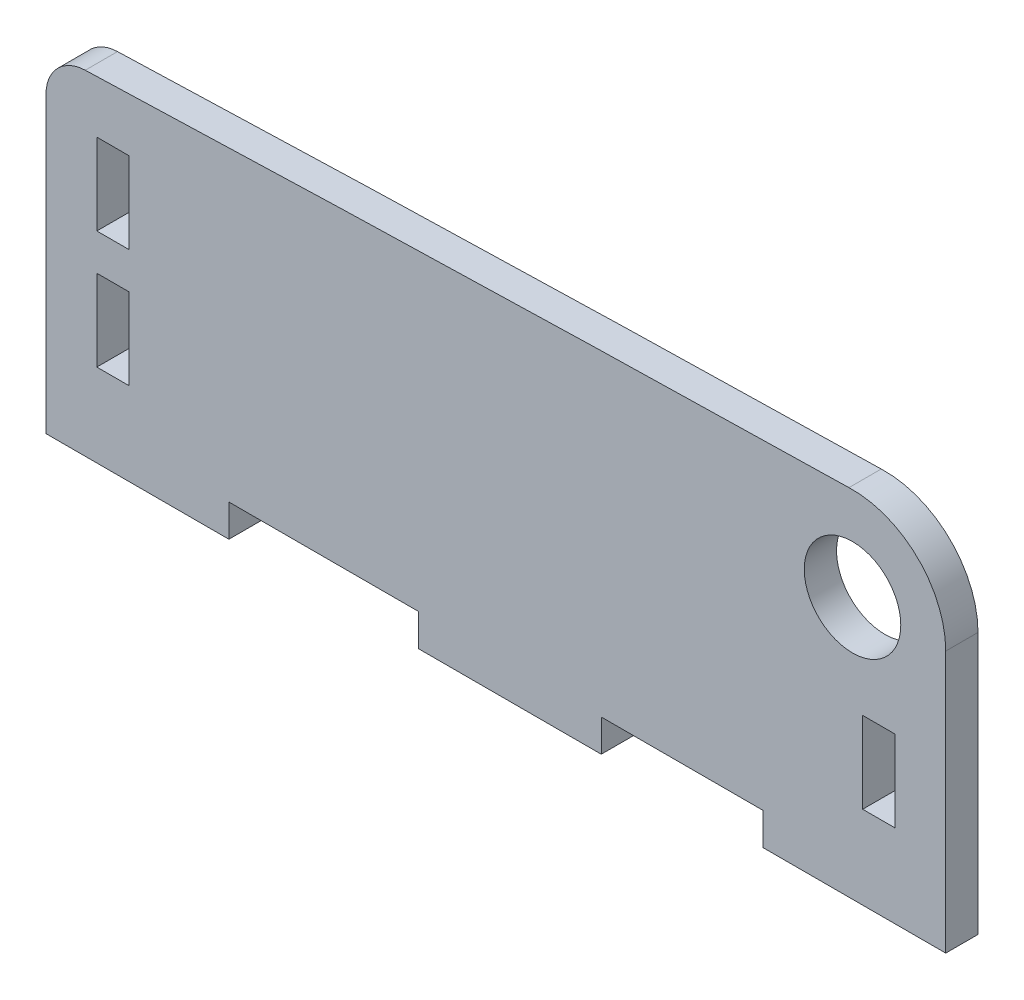
ISO-10303-21;
HEADER;
FILE_DESCRIPTION(('STEP AP214'),'2;1');
FILE_NAME('part.step','',(''),(''),'','','');
FILE_SCHEMA(('AUTOMOTIVE_DESIGN { 1 0 10303 214 1 1 1 1 }'));
ENDSEC;
DATA;
#1=APPLICATION_CONTEXT('core data for automotive mechanical design processes');
#2=APPLICATION_PROTOCOL_DEFINITION('international standard','automotive_design',2000,#1);
#3=PRODUCT_CONTEXT('',#1,'mechanical');
#4=PRODUCT('Part','Part','',(#3));
#5=PRODUCT_RELATED_PRODUCT_CATEGORY('part','',(#4));
#6=PRODUCT_DEFINITION_FORMATION('','',#4);
#7=PRODUCT_DEFINITION_CONTEXT('part definition',#1,'design');
#8=PRODUCT_DEFINITION('design','',#6,#7);
#9=PRODUCT_DEFINITION_SHAPE('','',#8);
#10=(LENGTH_UNIT() NAMED_UNIT(*) SI_UNIT(.MILLI.,.METRE.));
#11=(NAMED_UNIT(*) PLANE_ANGLE_UNIT() SI_UNIT($,.RADIAN.));
#12=(NAMED_UNIT(*) SI_UNIT($,.STERADIAN.) SOLID_ANGLE_UNIT());
#13=UNCERTAINTY_MEASURE_WITH_UNIT(LENGTH_MEASURE(1.E-05),#10,'distance_accuracy_value','');
#14=(GEOMETRIC_REPRESENTATION_CONTEXT(3) GLOBAL_UNCERTAINTY_ASSIGNED_CONTEXT((#13)) GLOBAL_UNIT_ASSIGNED_CONTEXT((#10,
#11,#12)) REPRESENTATION_CONTEXT('',''));
#15=CARTESIAN_POINT('',(0.,0.,0.));
#16=DIRECTION('',(0.,0.,1.));
#17=DIRECTION('',(1.,0.,0.));
#18=AXIS2_PLACEMENT_3D('',#15,#16,#17);
#19=CARTESIAN_POINT('',(26.416,-14.8,3.175));
#20=DIRECTION('',(0.,-1.,0.));
#21=DIRECTION('',(1.,0.,0.));
#22=AXIS2_PLACEMENT_3D('',#19,#20,#21);
#23=PLANE('',#22);
#24=DIRECTION('',(0.,0.,-1.));
#25=VECTOR('',#24,1.);
#26=CARTESIAN_POINT('',(-20.8,-14.8,21.4528725512572));
#27=LINE('',#26,#25);
#28=CARTESIAN_POINT('',(-20.8,-14.8,3.175));
#29=VERTEX_POINT('',#28);
#30=CARTESIAN_POINT('',(-20.8,-14.8,0.));
#31=VERTEX_POINT('',#30);
#32=EDGE_CURVE('E59',#29,#31,#27,.T.);
#33=ORIENTED_EDGE('',*,*,#32,.T.);
#34=DIRECTION('',(-1.,0.,0.));
#35=VECTOR('',#34,1.);
#36=CARTESIAN_POINT('',(26.416,-14.8,0.));
#37=LINE('',#36,#35);
#38=CARTESIAN_POINT('',(-2.15000000000001,-14.8,0.));
#39=VERTEX_POINT('',#38);
#40=EDGE_CURVE('E273',#39,#31,#37,.T.);
#41=ORIENTED_EDGE('',*,*,#40,.F.);
#42=DIRECTION('',(0.,0.,-1.));
#43=VECTOR('',#42,1.);
#44=CARTESIAN_POINT('',(-2.15000000000001,-14.8,21.4528725512572));
#45=LINE('',#44,#43);
#46=CARTESIAN_POINT('',(-2.15000000000001,-14.8,3.175));
#47=VERTEX_POINT('',#46);
#48=EDGE_CURVE('E599',#47,#39,#45,.T.);
#49=ORIENTED_EDGE('',*,*,#48,.F.);
#50=DIRECTION('',(-1.,0.,0.));
#51=VECTOR('',#50,1.);
#52=CARTESIAN_POINT('',(26.416,-14.8,3.175));
#53=LINE('',#52,#51);
#54=EDGE_CURVE('E64',#47,#29,#53,.T.);
#55=ORIENTED_EDGE('',*,*,#54,.T.);
#56=EDGE_LOOP('',(#33,#41,#49,#55));
#57=FACE_BOUND('',#56,.T.);
#58=ADVANCED_FACE('F44',(#57),#23,.T.);
#59=CARTESIAN_POINT('',(40.576,7.77,15.1599874843489));
#60=DIRECTION('',(0.,0.,-1.));
#61=DIRECTION('',(-1.,0.,0.));
#62=AXIS2_PLACEMENT_3D('',#59,#60,#61);
#63=CYLINDRICAL_SURFACE('',#62,9.17500000000001);
#64=CARTESIAN_POINT('',(40.576,7.77,0.));
#65=DIRECTION('',(0.,0.,-1.));
#66=DIRECTION('',(-1.,0.,0.));
#67=AXIS2_PLACEMENT_3D('',#64,#65,#66);
#68=CIRCLE('',#67,9.17500000000001);
#69=CARTESIAN_POINT('',(40.2258480765746,16.9383160193419,0.));
#70=VERTEX_POINT('',#69);
#71=CARTESIAN_POINT('',(49.751,7.77,0.));
#72=VERTEX_POINT('',#71);
#73=EDGE_CURVE('E324',#70,#72,#68,.T.);
#74=ORIENTED_EDGE('',*,*,#73,.F.);
#75=DIRECTION('',(0.,0.,-1.));
#76=VECTOR('',#75,1.);
#77=CARTESIAN_POINT('',(40.2258480765746,16.9383160193419,82.2297725290536));
#78=LINE('',#77,#76);
#79=CARTESIAN_POINT('',(40.2258480765746,16.9383160193419,3.175));
#80=VERTEX_POINT('',#79);
#81=EDGE_CURVE('E463',#80,#70,#78,.T.);
#82=ORIENTED_EDGE('',*,*,#81,.F.);
#83=CARTESIAN_POINT('',(40.576,7.77,3.175));
#84=DIRECTION('',(0.,0.,1.));
#85=DIRECTION('',(1.,0.,0.));
#86=AXIS2_PLACEMENT_3D('',#83,#84,#85);
#87=CIRCLE('',#86,9.17500000000001);
#88=CARTESIAN_POINT('',(49.751,7.77,3.175));
#89=VERTEX_POINT('',#88);
#90=EDGE_CURVE('E328',#80,#89,#87,.F.);
#91=ORIENTED_EDGE('',*,*,#90,.T.);
#92=DIRECTION('',(0.,0.,-1.));
#93=VECTOR('',#92,1.);
#94=CARTESIAN_POINT('',(49.751,7.77,10.));
#95=LINE('',#94,#93);
#96=EDGE_CURVE('E316',#89,#72,#95,.T.);
#97=ORIENTED_EDGE('',*,*,#96,.T.);
#98=EDGE_LOOP('',(#74,#82,#91,#97));
#99=FACE_BOUND('',#98,.T.);
#100=ADVANCED_FACE('F486',(#99),#63,.T.);
#101=CARTESIAN_POINT('',(-30.625,0.,33.0727537785032));
#102=DIRECTION('',(1.,0.,0.));
#103=DIRECTION('',(0.,1.,0.));
#104=AXIS2_PLACEMENT_3D('',#101,#102,#103);
#105=PLANE('',#104);
#106=DIRECTION('',(0.,0.,-1.));
#107=VECTOR('',#106,1.);
#108=CARTESIAN_POINT('',(-30.625,-9.79999999999999,33.8831524191867));
#109=LINE('',#108,#107);
#110=CARTESIAN_POINT('',(-30.625,-9.79999999999999,3.175));
#111=VERTEX_POINT('',#110);
#112=CARTESIAN_POINT('',(-30.625,-9.79999999999999,0.));
#113=VERTEX_POINT('',#112);
#114=EDGE_CURVE('E342',#111,#113,#109,.T.);
#115=ORIENTED_EDGE('',*,*,#114,.F.);
#116=DIRECTION('',(0.,-1.,0.));
#117=VECTOR('',#116,1.);
#118=CARTESIAN_POINT('',(-30.625,0.,3.175));
#119=LINE('',#118,#117);
#120=CARTESIAN_POINT('',(-30.625,-1.79999999999999,3.175));
#121=VERTEX_POINT('',#120);
#122=EDGE_CURVE('E318',#121,#111,#119,.T.);
#123=ORIENTED_EDGE('',*,*,#122,.F.);
#124=DIRECTION('',(0.,0.,-1.));
#125=VECTOR('',#124,1.);
#126=CARTESIAN_POINT('',(-30.625,-1.79999999999999,33.8831524191867));
#127=LINE('',#126,#125);
#128=CARTESIAN_POINT('',(-30.625,-1.79999999999999,0.));
#129=VERTEX_POINT('',#128);
#130=EDGE_CURVE('E369',#121,#129,#127,.T.);
#131=ORIENTED_EDGE('',*,*,#130,.T.);
#132=DIRECTION('',(0.,-1.,0.));
#133=VECTOR('',#132,1.);
#134=CARTESIAN_POINT('',(-30.625,0.,0.));
#135=LINE('',#134,#133);
#136=EDGE_CURVE('E356',#129,#113,#135,.T.);
#137=ORIENTED_EDGE('',*,*,#136,.T.);
#138=EDGE_LOOP('',(#115,#123,#131,#137));
#139=FACE_BOUND('',#138,.T.);
#140=ADVANCED_FACE('F553',(#139),#105,.F.);
#141=DIRECTION('',(0.,0.,-1.));
#142=VECTOR('',#141,1.);
#143=CARTESIAN_POINT('',(-30.625,1.8,33.8831524191867));
#144=LINE('',#143,#142);
#145=CARTESIAN_POINT('',(-30.625,1.8,3.175));
#146=VERTEX_POINT('',#145);
#147=CARTESIAN_POINT('',(-30.625,1.8,0.));
#148=VERTEX_POINT('',#147);
#149=EDGE_CURVE('E372',#146,#148,#144,.T.);
#150=ORIENTED_EDGE('',*,*,#149,.F.);
#151=CARTESIAN_POINT('',(-30.625,9.8,3.175));
#152=VERTEX_POINT('',#151);
#153=EDGE_CURVE('E317',#152,#146,#119,.T.);
#154=ORIENTED_EDGE('',*,*,#153,.F.);
#155=DIRECTION('',(0.,0.,-1.));
#156=VECTOR('',#155,1.);
#157=CARTESIAN_POINT('',(-30.625,9.8,33.8831524191867));
#158=LINE('',#157,#156);
#159=CARTESIAN_POINT('',(-30.625,9.8,0.));
#160=VERTEX_POINT('',#159);
#161=EDGE_CURVE('E376',#152,#160,#158,.T.);
#162=ORIENTED_EDGE('',*,*,#161,.T.);
#163=EDGE_CURVE('E381',#160,#148,#135,.T.);
#164=ORIENTED_EDGE('',*,*,#163,.T.);
#165=EDGE_LOOP('',(#150,#154,#162,#164));
#166=FACE_BOUND('',#165,.T.);
#167=ADVANCED_FACE('F420',(#166),#105,.F.);
#168=CARTESIAN_POINT('',(0.,0.,0.));
#169=DIRECTION('',(0.,0.,1.));
#170=DIRECTION('',(1.,0.,0.));
#171=AXIS2_PLACEMENT_3D('',#168,#169,#170);
#172=PLANE('',#171);
#173=DIRECTION('',(-1.,0.,0.));
#174=VECTOR('',#173,1.);
#175=CARTESIAN_POINT('',(44.751,-9.79999999999999,0.));
#176=LINE('',#175,#174);
#177=CARTESIAN_POINT('',(44.751,-9.79999999999999,0.));
#178=VERTEX_POINT('',#177);
#179=CARTESIAN_POINT('',(41.576,-9.79999999999999,0.));
#180=VERTEX_POINT('',#179);
#181=EDGE_CURVE('E436',#178,#180,#176,.T.);
#182=ORIENTED_EDGE('',*,*,#181,.F.);
#183=DIRECTION('',(0.,-1.,0.));
#184=VECTOR('',#183,1.);
#185=CARTESIAN_POINT('',(44.751,-9.79999999999999,0.));
#186=LINE('',#185,#184);
#187=CARTESIAN_POINT('',(44.751,-1.79999999999999,0.));
#188=VERTEX_POINT('',#187);
#189=EDGE_CURVE('E442',#188,#178,#186,.T.);
#190=ORIENTED_EDGE('',*,*,#189,.F.);
#191=DIRECTION('',(1.,0.,0.));
#192=VECTOR('',#191,1.);
#193=CARTESIAN_POINT('',(44.751,-1.79999999999999,0.));
#194=LINE('',#193,#192);
#195=CARTESIAN_POINT('',(41.576,-1.79999999999999,0.));
#196=VERTEX_POINT('',#195);
#197=EDGE_CURVE('E435',#196,#188,#194,.T.);
#198=ORIENTED_EDGE('',*,*,#197,.F.);
#199=DIRECTION('',(0.,1.,0.));
#200=VECTOR('',#199,1.);
#201=CARTESIAN_POINT('',(41.576,-9.79999999999999,0.));
#202=LINE('',#201,#200);
#203=EDGE_CURVE('E432',#180,#196,#202,.T.);
#204=ORIENTED_EDGE('',*,*,#203,.F.);
#205=EDGE_LOOP('',(#182,#190,#198,#204));
#206=FACE_BOUND('',#205,.T.);
#207=DIRECTION('',(-1.,0.,0.));
#208=VECTOR('',#207,1.);
#209=CARTESIAN_POINT('',(0.,-9.79999999999999,0.));
#210=LINE('',#209,#208);
#211=CARTESIAN_POINT('',(-33.8,-9.79999999999999,0.));
#212=VERTEX_POINT('',#211);
#213=EDGE_CURVE('E363',#113,#212,#210,.T.);
#214=ORIENTED_EDGE('',*,*,#213,.F.);
#215=ORIENTED_EDGE('',*,*,#136,.F.);
#216=DIRECTION('',(-1.,0.,0.));
#217=VECTOR('',#216,1.);
#218=CARTESIAN_POINT('',(0.,-1.79999999999999,0.));
#219=LINE('',#218,#217);
#220=CARTESIAN_POINT('',(-33.8,-1.79999999999999,0.));
#221=VERTEX_POINT('',#220);
#222=EDGE_CURVE('E395',#129,#221,#219,.T.);
#223=ORIENTED_EDGE('',*,*,#222,.T.);
#224=DIRECTION('',(0.,-1.,0.));
#225=VECTOR('',#224,1.);
#226=CARTESIAN_POINT('',(-33.8,0.,0.));
#227=LINE('',#226,#225);
#228=EDGE_CURVE('E228',#221,#212,#227,.T.);
#229=ORIENTED_EDGE('',*,*,#228,.T.);
#230=EDGE_LOOP('',(#214,#215,#223,#229));
#231=FACE_BOUND('',#230,.T.);
#232=DIRECTION('',(-1.,0.,0.));
#233=VECTOR('',#232,1.);
#234=CARTESIAN_POINT('',(0.,1.8,0.));
#235=LINE('',#234,#233);
#236=CARTESIAN_POINT('',(-33.8,1.8,0.));
#237=VERTEX_POINT('',#236);
#238=EDGE_CURVE('E352',#148,#237,#235,.T.);
#239=ORIENTED_EDGE('',*,*,#238,.F.);
#240=ORIENTED_EDGE('',*,*,#163,.F.);
#241=DIRECTION('',(-1.,0.,0.));
#242=VECTOR('',#241,1.);
#243=CARTESIAN_POINT('',(0.,9.8,0.));
#244=LINE('',#243,#242);
#245=CARTESIAN_POINT('',(-33.8,9.8,0.));
#246=VERTEX_POINT('',#245);
#247=EDGE_CURVE('E344',#160,#246,#244,.T.);
#248=ORIENTED_EDGE('',*,*,#247,.T.);
#249=DIRECTION('',(0.,-1.,0.));
#250=VECTOR('',#249,1.);
#251=CARTESIAN_POINT('',(-33.8,0.,0.));
#252=LINE('',#251,#250);
#253=EDGE_CURVE('E397',#246,#237,#252,.T.);
#254=ORIENTED_EDGE('',*,*,#253,.T.);
#255=EDGE_LOOP('',(#239,#240,#248,#254));
#256=FACE_BOUND('',#255,.T.);
#257=CARTESIAN_POINT('',(40.576,7.77,0.));
#258=DIRECTION('',(0.,0.,-1.));
#259=DIRECTION('',(-1.,0.,0.));
#260=AXIS2_PLACEMENT_3D('',#257,#258,#259);
#261=CIRCLE('',#260,4.75);
#262=CARTESIAN_POINT('',(35.826,7.77,0.));
#263=VERTEX_POINT('',#262);
#264=EDGE_CURVE('E329',#263,#263,#261,.T.);
#265=ORIENTED_EDGE('',*,*,#264,.F.);
#266=EDGE_LOOP('',(#265));
#267=FACE_BOUND('',#266,.T.);
#268=DIRECTION('',(0.,-1.,0.));
#269=VECTOR('',#268,1.);
#270=CARTESIAN_POINT('',(-38.8,0.,0.));
#271=LINE('',#270,#269);
#272=CARTESIAN_POINT('',(-38.8,10.9360380146031,0.));
#273=VERTEX_POINT('',#272);
#274=CARTESIAN_POINT('',(-38.8,-17.975,0.));
#275=VERTEX_POINT('',#274);
#276=EDGE_CURVE('E234',#273,#275,#271,.T.);
#277=ORIENTED_EDGE('',*,*,#276,.F.);
#278=CARTESIAN_POINT('',(-34.8,10.9360380146031,0.));
#279=DIRECTION('',(0.,0.,1.));
#280=DIRECTION('',(1.,0.,0.));
#281=AXIS2_PLACEMENT_3D('',#278,#279,#280);
#282=CIRCLE('',#281,4.);
#283=CARTESIAN_POINT('',(-34.9367995007202,14.9336980672583,0.));
#284=VERTEX_POINT('',#283);
#285=EDGE_CURVE('E485',#273,#284,#282,.F.);
#286=ORIENTED_EDGE('',*,*,#285,.T.);
#287=CARTESIAN_POINT('',(135.530776045635,-4966.60068946307,0.));
#288=DIRECTION('',(0.,0.,-1.));
#289=DIRECTION('',(-1.,0.,0.));
#290=AXIS2_PLACEMENT_3D('',#287,#288,#289);
#291=CIRCLE('',#290,4984.45022529665);
#292=EDGE_CURVE('E469',#70,#284,#291,.F.);
#293=ORIENTED_EDGE('',*,*,#292,.F.);
#294=ORIENTED_EDGE('',*,*,#73,.T.);
#295=DIRECTION('',(0.,-1.,0.));
#296=VECTOR('',#295,1.);
#297=CARTESIAN_POINT('',(49.751,0.,0.));
#298=LINE('',#297,#296);
#299=CARTESIAN_POINT('',(49.751,-17.975,0.));
#300=VERTEX_POINT('',#299);
#301=EDGE_CURVE('E311',#72,#300,#298,.T.);
#302=ORIENTED_EDGE('',*,*,#301,.T.);
#303=DIRECTION('',(-1.,0.,0.));
#304=VECTOR('',#303,1.);
#305=CARTESIAN_POINT('',(49.751,-17.975,0.));
#306=LINE('',#305,#304);
#307=CARTESIAN_POINT('',(31.751,-17.975,0.));
#308=VERTEX_POINT('',#307);
#309=EDGE_CURVE('E297',#300,#308,#306,.T.);
#310=ORIENTED_EDGE('',*,*,#309,.T.);
#311=DIRECTION('',(0.,-1.,0.));
#312=VECTOR('',#311,1.);
#313=CARTESIAN_POINT('',(31.751,-14.8,0.));
#314=LINE('',#313,#312);
#315=CARTESIAN_POINT('',(31.751,-14.8,0.));
#316=VERTEX_POINT('',#315);
#317=EDGE_CURVE('E292',#316,#308,#314,.T.);
#318=ORIENTED_EDGE('',*,*,#317,.F.);
#319=CARTESIAN_POINT('',(15.85,-14.8,0.));
#320=VERTEX_POINT('',#319);
#321=EDGE_CURVE('E267',#316,#320,#37,.T.);
#322=ORIENTED_EDGE('',*,*,#321,.T.);
#323=DIRECTION('',(0.,-1.,0.));
#324=VECTOR('',#323,1.);
#325=CARTESIAN_POINT('',(15.85,-14.8,0.));
#326=LINE('',#325,#324);
#327=CARTESIAN_POINT('',(15.85,-17.975,0.));
#328=VERTEX_POINT('',#327);
#329=EDGE_CURVE('E246',#320,#328,#326,.T.);
#330=ORIENTED_EDGE('',*,*,#329,.T.);
#331=DIRECTION('',(-1.,0.,0.));
#332=VECTOR('',#331,1.);
#333=CARTESIAN_POINT('',(15.85,-17.975,0.));
#334=LINE('',#333,#332);
#335=CARTESIAN_POINT('',(-2.15000000000001,-17.975,0.));
#336=VERTEX_POINT('',#335);
#337=EDGE_CURVE('E289',#328,#336,#334,.T.);
#338=ORIENTED_EDGE('',*,*,#337,.T.);
#339=DIRECTION('',(0.,-1.,0.));
#340=VECTOR('',#339,1.);
#341=CARTESIAN_POINT('',(-2.15000000000001,-14.8,0.));
#342=LINE('',#341,#340);
#343=EDGE_CURVE('E290',#39,#336,#342,.T.);
#344=ORIENTED_EDGE('',*,*,#343,.F.);
#345=ORIENTED_EDGE('',*,*,#40,.T.);
#346=DIRECTION('',(0.,-1.,0.));
#347=VECTOR('',#346,1.);
#348=CARTESIAN_POINT('',(-20.8,-14.8,0.));
#349=LINE('',#348,#347);
#350=CARTESIAN_POINT('',(-20.8,-17.975,0.));
#351=VERTEX_POINT('',#350);
#352=EDGE_CURVE('E255',#31,#351,#349,.T.);
#353=ORIENTED_EDGE('',*,*,#352,.T.);
#354=DIRECTION('',(-1.,0.,0.));
#355=VECTOR('',#354,1.);
#356=CARTESIAN_POINT('',(-20.8,-17.975,0.));
#357=LINE('',#356,#355);
#358=EDGE_CURVE('E251',#351,#275,#357,.T.);
#359=ORIENTED_EDGE('',*,*,#358,.T.);
#360=EDGE_LOOP('',(#277,#286,#293,#294,#302,#310,#318,#322,#330,#338,#344,#345,#353,#359));
#361=FACE_BOUND('',#360,.T.);
#362=ADVANCED_FACE('F410',(#206,#231,#256,#267,#361),#172,.F.);
#363=CARTESIAN_POINT('',(0.,0.,3.175));
#364=DIRECTION('',(0.,0.,1.));
#365=DIRECTION('',(1.,0.,0.));
#366=AXIS2_PLACEMENT_3D('',#363,#364,#365);
#367=PLANE('',#366);
#368=DIRECTION('',(0.,1.,0.));
#369=VECTOR('',#368,1.);
#370=CARTESIAN_POINT('',(44.751,0.,3.175));
#371=LINE('',#370,#369);
#372=CARTESIAN_POINT('',(44.751,-9.79999999999999,3.175));
#373=VERTEX_POINT('',#372);
#374=CARTESIAN_POINT('',(44.751,-1.79999999999999,3.175));
#375=VERTEX_POINT('',#374);
#376=EDGE_CURVE('E12',#373,#375,#371,.T.);
#377=ORIENTED_EDGE('',*,*,#376,.F.);
#378=DIRECTION('',(1.,0.,0.));
#379=VECTOR('',#378,1.);
#380=CARTESIAN_POINT('',(0.,-9.79999999999999,3.175));
#381=LINE('',#380,#379);
#382=CARTESIAN_POINT('',(41.576,-9.79999999999999,3.175));
#383=VERTEX_POINT('',#382);
#384=EDGE_CURVE('E521',#383,#373,#381,.T.);
#385=ORIENTED_EDGE('',*,*,#384,.F.);
#386=DIRECTION('',(0.,-1.,0.));
#387=VECTOR('',#386,1.);
#388=CARTESIAN_POINT('',(41.576,0.,3.175));
#389=LINE('',#388,#387);
#390=CARTESIAN_POINT('',(41.576,-1.79999999999999,3.175));
#391=VERTEX_POINT('',#390);
#392=EDGE_CURVE('E523',#391,#383,#389,.T.);
#393=ORIENTED_EDGE('',*,*,#392,.F.);
#394=DIRECTION('',(-1.,0.,0.));
#395=VECTOR('',#394,1.);
#396=CARTESIAN_POINT('',(0.,-1.79999999999999,3.175));
#397=LINE('',#396,#395);
#398=EDGE_CURVE('E52',#375,#391,#397,.T.);
#399=ORIENTED_EDGE('',*,*,#398,.F.);
#400=EDGE_LOOP('',(#377,#385,#393,#399));
#401=FACE_BOUND('',#400,.T.);
#402=DIRECTION('',(-1.,0.,0.));
#403=VECTOR('',#402,1.);
#404=CARTESIAN_POINT('',(0.,9.8,3.175));
#405=LINE('',#404,#403);
#406=CARTESIAN_POINT('',(-33.8,9.8,3.175));
#407=VERTEX_POINT('',#406);
#408=EDGE_CURVE('E346',#152,#407,#405,.T.);
#409=ORIENTED_EDGE('',*,*,#408,.F.);
#410=ORIENTED_EDGE('',*,*,#153,.T.);
#411=DIRECTION('',(-1.,0.,0.));
#412=VECTOR('',#411,1.);
#413=CARTESIAN_POINT('',(0.,1.8,3.175));
#414=LINE('',#413,#412);
#415=CARTESIAN_POINT('',(-33.8,1.8,3.175));
#416=VERTEX_POINT('',#415);
#417=EDGE_CURVE('E353',#146,#416,#414,.T.);
#418=ORIENTED_EDGE('',*,*,#417,.T.);
#419=DIRECTION('',(0.,-1.,0.));
#420=VECTOR('',#419,1.);
#421=CARTESIAN_POINT('',(-33.8,0.,3.175));
#422=LINE('',#421,#420);
#423=EDGE_CURVE('E350',#407,#416,#422,.T.);
#424=ORIENTED_EDGE('',*,*,#423,.F.);
#425=EDGE_LOOP('',(#409,#410,#418,#424));
#426=FACE_BOUND('',#425,.T.);
#427=CARTESIAN_POINT('',(135.530776045635,-4966.60068946307,3.175));
#428=DIRECTION('',(0.,0.,1.));
#429=DIRECTION('',(1.,0.,0.));
#430=AXIS2_PLACEMENT_3D('',#427,#428,#429);
#431=CIRCLE('',#430,4984.45022529665);
#432=CARTESIAN_POINT('',(-34.9367995007202,14.9336980672583,3.175));
#433=VERTEX_POINT('',#432);
#434=EDGE_CURVE('E343',#80,#433,#431,.T.);
#435=ORIENTED_EDGE('',*,*,#434,.T.);
#436=CARTESIAN_POINT('',(-34.8,10.9360380146031,3.175));
#437=DIRECTION('',(0.,0.,1.));
#438=DIRECTION('',(1.,0.,0.));
#439=AXIS2_PLACEMENT_3D('',#436,#437,#438);
#440=CIRCLE('',#439,4.);
#441=CARTESIAN_POINT('',(-38.8,10.9360380146031,3.175));
#442=VERTEX_POINT('',#441);
#443=EDGE_CURVE('E223',#433,#442,#440,.T.);
#444=ORIENTED_EDGE('',*,*,#443,.T.);
#445=DIRECTION('',(0.,-1.,0.));
#446=VECTOR('',#445,1.);
#447=CARTESIAN_POINT('',(-38.8,0.,3.175));
#448=LINE('',#447,#446);
#449=CARTESIAN_POINT('',(-38.8,-17.975,3.175));
#450=VERTEX_POINT('',#449);
#451=EDGE_CURVE('E214',#442,#450,#448,.T.);
#452=ORIENTED_EDGE('',*,*,#451,.T.);
#453=DIRECTION('',(-1.,0.,0.));
#454=VECTOR('',#453,1.);
#455=CARTESIAN_POINT('',(-20.8,-17.975,3.175));
#456=LINE('',#455,#454);
#457=CARTESIAN_POINT('',(-20.8,-17.975,3.175));
#458=VERTEX_POINT('',#457);
#459=EDGE_CURVE('E221',#458,#450,#456,.T.);
#460=ORIENTED_EDGE('',*,*,#459,.F.);
#461=DIRECTION('',(0.,-1.,0.));
#462=VECTOR('',#461,1.);
#463=CARTESIAN_POINT('',(-20.8,-14.8,3.175));
#464=LINE('',#463,#462);
#465=EDGE_CURVE('E238',#29,#458,#464,.T.);
#466=ORIENTED_EDGE('',*,*,#465,.F.);
#467=ORIENTED_EDGE('',*,*,#54,.F.);
#468=DIRECTION('',(0.,-1.,0.));
#469=VECTOR('',#468,1.);
#470=CARTESIAN_POINT('',(-2.15000000000001,-14.8,3.175));
#471=LINE('',#470,#469);
#472=CARTESIAN_POINT('',(-2.15000000000001,-17.975,3.175));
#473=VERTEX_POINT('',#472);
#474=EDGE_CURVE('E243',#47,#473,#471,.T.);
#475=ORIENTED_EDGE('',*,*,#474,.T.);
#476=DIRECTION('',(-1.,0.,0.));
#477=VECTOR('',#476,1.);
#478=CARTESIAN_POINT('',(15.85,-17.975,3.175));
#479=LINE('',#478,#477);
#480=CARTESIAN_POINT('',(15.85,-17.975,3.175));
#481=VERTEX_POINT('',#480);
#482=EDGE_CURVE('E606',#481,#473,#479,.T.);
#483=ORIENTED_EDGE('',*,*,#482,.F.);
#484=DIRECTION('',(0.,-1.,0.));
#485=VECTOR('',#484,1.);
#486=CARTESIAN_POINT('',(15.85,-14.8,3.175));
#487=LINE('',#486,#485);
#488=CARTESIAN_POINT('',(15.85,-14.8,3.175));
#489=VERTEX_POINT('',#488);
#490=EDGE_CURVE('E512',#489,#481,#487,.T.);
#491=ORIENTED_EDGE('',*,*,#490,.F.);
#492=CARTESIAN_POINT('',(31.751,-14.8,3.175));
#493=VERTEX_POINT('',#492);
#494=EDGE_CURVE('E274',#493,#489,#53,.T.);
#495=ORIENTED_EDGE('',*,*,#494,.F.);
#496=DIRECTION('',(0.,-1.,0.));
#497=VECTOR('',#496,1.);
#498=CARTESIAN_POINT('',(31.751,-14.8,3.175));
#499=LINE('',#498,#497);
#500=CARTESIAN_POINT('',(31.751,-17.975,3.175));
#501=VERTEX_POINT('',#500);
#502=EDGE_CURVE('E303',#493,#501,#499,.T.);
#503=ORIENTED_EDGE('',*,*,#502,.T.);
#504=DIRECTION('',(-1.,0.,0.));
#505=VECTOR('',#504,1.);
#506=CARTESIAN_POINT('',(49.751,-17.975,3.175));
#507=LINE('',#506,#505);
#508=CARTESIAN_POINT('',(49.751,-17.975,3.175));
#509=VERTEX_POINT('',#508);
#510=EDGE_CURVE('E304',#509,#501,#507,.T.);
#511=ORIENTED_EDGE('',*,*,#510,.F.);
#512=DIRECTION('',(0.,1.,0.));
#513=VECTOR('',#512,1.);
#514=CARTESIAN_POINT('',(49.751,0.,3.175));
#515=LINE('',#514,#513);
#516=EDGE_CURVE('E322',#509,#89,#515,.T.);
#517=ORIENTED_EDGE('',*,*,#516,.T.);
#518=ORIENTED_EDGE('',*,*,#90,.F.);
#519=EDGE_LOOP('',(#435,#444,#452,#460,#466,#467,#475,#483,#491,#495,#503,#511,#517,#518));
#520=FACE_BOUND('',#519,.T.);
#521=CARTESIAN_POINT('',(40.576,7.77,3.175));
#522=DIRECTION('',(0.,0.,1.));
#523=DIRECTION('',(1.,0.,0.));
#524=AXIS2_PLACEMENT_3D('',#521,#522,#523);
#525=CIRCLE('',#524,4.75);
#526=CARTESIAN_POINT('',(45.326,7.77,3.175));
#527=VERTEX_POINT('',#526);
#528=EDGE_CURVE('E276',#527,#527,#525,.T.);
#529=ORIENTED_EDGE('',*,*,#528,.F.);
#530=EDGE_LOOP('',(#529));
#531=FACE_BOUND('',#530,.T.);
#532=DIRECTION('',(-1.,0.,0.));
#533=VECTOR('',#532,1.);
#534=CARTESIAN_POINT('',(0.,-1.79999999999999,3.175));
#535=LINE('',#534,#533);
#536=CARTESIAN_POINT('',(-33.8,-1.79999999999999,3.175));
#537=VERTEX_POINT('',#536);
#538=EDGE_CURVE('E357',#121,#537,#535,.T.);
#539=ORIENTED_EDGE('',*,*,#538,.F.);
#540=ORIENTED_EDGE('',*,*,#122,.T.);
#541=DIRECTION('',(-1.,0.,0.));
#542=VECTOR('',#541,1.);
#543=CARTESIAN_POINT('',(0.,-9.79999999999999,3.175));
#544=LINE('',#543,#542);
#545=CARTESIAN_POINT('',(-33.8,-9.79999999999999,3.175));
#546=VERTEX_POINT('',#545);
#547=EDGE_CURVE('E227',#111,#546,#544,.T.);
#548=ORIENTED_EDGE('',*,*,#547,.T.);
#549=DIRECTION('',(0.,-1.,0.));
#550=VECTOR('',#549,1.);
#551=CARTESIAN_POINT('',(-33.8,0.,3.175));
#552=LINE('',#551,#550);
#553=EDGE_CURVE('E361',#537,#546,#552,.T.);
#554=ORIENTED_EDGE('',*,*,#553,.F.);
#555=EDGE_LOOP('',(#539,#540,#548,#554));
#556=FACE_BOUND('',#555,.T.);
#557=ADVANCED_FACE('F217',(#401,#426,#520,#531,#556),#367,.T.);
#558=DIRECTION('',(0.,0.,-1.));
#559=VECTOR('',#558,1.);
#560=CARTESIAN_POINT('',(15.85,-14.8,21.4528725512572));
#561=LINE('',#560,#559);
#562=EDGE_CURVE('E601',#489,#320,#561,.T.);
#563=ORIENTED_EDGE('',*,*,#562,.T.);
#564=ORIENTED_EDGE('',*,*,#321,.F.);
#565=DIRECTION('',(0.,0.,-1.));
#566=VECTOR('',#565,1.);
#567=CARTESIAN_POINT('',(31.751,-14.8,21.4528725512572));
#568=LINE('',#567,#566);
#569=EDGE_CURVE('E298',#493,#316,#568,.T.);
#570=ORIENTED_EDGE('',*,*,#569,.F.);
#571=ORIENTED_EDGE('',*,*,#494,.T.);
#572=EDGE_LOOP('',(#563,#564,#570,#571));
#573=FACE_BOUND('',#572,.T.);
#574=ADVANCED_FACE('F563',(#573),#23,.T.);
#575=CARTESIAN_POINT('',(40.576,7.77,10.));
#576=DIRECTION('',(0.,0.,-1.));
#577=DIRECTION('',(-1.,0.,0.));
#578=AXIS2_PLACEMENT_3D('',#575,#576,#577);
#579=CYLINDRICAL_SURFACE('',#578,4.75);
#580=ORIENTED_EDGE('',*,*,#528,.T.);
#581=EDGE_LOOP('',(#580));
#582=FACE_BOUND('',#581,.T.);
#583=ORIENTED_EDGE('',*,*,#264,.T.);
#584=EDGE_LOOP('',(#583));
#585=FACE_BOUND('',#584,.T.);
#586=ADVANCED_FACE('F568',(#582,#585),#579,.F.);
#587=CARTESIAN_POINT('',(49.751,0.,10.));
#588=DIRECTION('',(1.,0.,0.));
#589=DIRECTION('',(0.,0.,-1.));
#590=AXIS2_PLACEMENT_3D('',#587,#588,#589);
#591=PLANE('',#590);
#592=ORIENTED_EDGE('',*,*,#516,.F.);
#593=DIRECTION('',(0.,0.,-1.));
#594=VECTOR('',#593,1.);
#595=CARTESIAN_POINT('',(49.751,-17.975,21.4528725512572));
#596=LINE('',#595,#594);
#597=EDGE_CURVE('E493',#509,#300,#596,.T.);
#598=ORIENTED_EDGE('',*,*,#597,.T.);
#599=ORIENTED_EDGE('',*,*,#301,.F.);
#600=ORIENTED_EDGE('',*,*,#96,.F.);
#601=EDGE_LOOP('',(#592,#598,#599,#600));
#602=FACE_BOUND('',#601,.T.);
#603=ADVANCED_FACE('F491',(#602),#591,.T.);
#604=CARTESIAN_POINT('',(-38.8,0.,33.8831524191867));
#605=DIRECTION('',(1.,0.,0.));
#606=DIRECTION('',(0.,1.,0.));
#607=AXIS2_PLACEMENT_3D('',#604,#605,#606);
#608=PLANE('',#607);
#609=ORIENTED_EDGE('',*,*,#451,.F.);
#610=DIRECTION('',(0.,0.,-1.));
#611=VECTOR('',#610,1.);
#612=CARTESIAN_POINT('',(-38.8,10.9360380146031,33.8831524191867));
#613=LINE('',#612,#611);
#614=EDGE_CURVE('E514',#442,#273,#613,.T.);
#615=ORIENTED_EDGE('',*,*,#614,.T.);
#616=ORIENTED_EDGE('',*,*,#276,.T.);
#617=DIRECTION('',(0.,0.,-1.));
#618=VECTOR('',#617,1.);
#619=CARTESIAN_POINT('',(-38.8,-17.975,21.4528725512572));
#620=LINE('',#619,#618);
#621=EDGE_CURVE('E231',#450,#275,#620,.T.);
#622=ORIENTED_EDGE('',*,*,#621,.F.);
#623=EDGE_LOOP('',(#609,#615,#616,#622));
#624=FACE_BOUND('',#623,.T.);
#625=ADVANCED_FACE('F232',(#624),#608,.F.);
#626=CARTESIAN_POINT('',(0.,-9.79999999999999,33.8831524191867));
#627=DIRECTION('',(0.,-1.,0.));
#628=DIRECTION('',(0.,0.,-1.));
#629=AXIS2_PLACEMENT_3D('',#626,#627,#628);
#630=PLANE('',#629);
#631=ORIENTED_EDGE('',*,*,#547,.F.);
#632=ORIENTED_EDGE('',*,*,#114,.T.);
#633=ORIENTED_EDGE('',*,*,#213,.T.);
#634=DIRECTION('',(0.,0.,-1.));
#635=VECTOR('',#634,1.);
#636=CARTESIAN_POINT('',(-33.8,-9.79999999999999,33.8831524191867));
#637=LINE('',#636,#635);
#638=EDGE_CURVE('E360',#546,#212,#637,.T.);
#639=ORIENTED_EDGE('',*,*,#638,.F.);
#640=EDGE_LOOP('',(#631,#632,#633,#639));
#641=FACE_BOUND('',#640,.T.);
#642=ADVANCED_FACE('F561',(#641),#630,.F.);
#643=CARTESIAN_POINT('',(-33.8,0.,33.8831524191867));
#644=DIRECTION('',(1.,0.,0.));
#645=DIRECTION('',(0.,0.,-1.));
#646=AXIS2_PLACEMENT_3D('',#643,#644,#645);
#647=PLANE('',#646);
#648=DIRECTION('',(0.,0.,-1.));
#649=VECTOR('',#648,1.);
#650=CARTESIAN_POINT('',(-33.8,-1.79999999999999,33.8831524191867));
#651=LINE('',#650,#649);
#652=EDGE_CURVE('E359',#537,#221,#651,.T.);
#653=ORIENTED_EDGE('',*,*,#652,.F.);
#654=ORIENTED_EDGE('',*,*,#553,.T.);
#655=ORIENTED_EDGE('',*,*,#638,.T.);
#656=ORIENTED_EDGE('',*,*,#228,.F.);
#657=EDGE_LOOP('',(#653,#654,#655,#656));
#658=FACE_BOUND('',#657,.T.);
#659=ADVANCED_FACE('F560',(#658),#647,.T.);
#660=CARTESIAN_POINT('',(0.,-1.79999999999999,33.8831524191867));
#661=DIRECTION('',(0.,-1.,0.));
#662=DIRECTION('',(0.,0.,-1.));
#663=AXIS2_PLACEMENT_3D('',#660,#661,#662);
#664=PLANE('',#663);
#665=ORIENTED_EDGE('',*,*,#130,.F.);
#666=ORIENTED_EDGE('',*,*,#538,.T.);
#667=ORIENTED_EDGE('',*,*,#652,.T.);
#668=ORIENTED_EDGE('',*,*,#222,.F.);
#669=EDGE_LOOP('',(#665,#666,#667,#668));
#670=FACE_BOUND('',#669,.T.);
#671=ADVANCED_FACE('F556',(#670),#664,.T.);
#672=CARTESIAN_POINT('',(0.,1.8,33.8831524191867));
#673=DIRECTION('',(0.,-1.,0.));
#674=DIRECTION('',(1.,0.,0.));
#675=AXIS2_PLACEMENT_3D('',#672,#673,#674);
#676=PLANE('',#675);
#677=ORIENTED_EDGE('',*,*,#417,.F.);
#678=ORIENTED_EDGE('',*,*,#149,.T.);
#679=ORIENTED_EDGE('',*,*,#238,.T.);
#680=DIRECTION('',(0.,0.,-1.));
#681=VECTOR('',#680,1.);
#682=CARTESIAN_POINT('',(-33.8,1.8,33.8831524191867));
#683=LINE('',#682,#681);
#684=EDGE_CURVE('E349',#416,#237,#683,.T.);
#685=ORIENTED_EDGE('',*,*,#684,.F.);
#686=EDGE_LOOP('',(#677,#678,#679,#685));
#687=FACE_BOUND('',#686,.T.);
#688=ADVANCED_FACE('F648',(#687),#676,.F.);
#689=CARTESIAN_POINT('',(-33.8,0.,33.8831524191867));
#690=DIRECTION('',(1.,0.,0.));
#691=DIRECTION('',(0.,0.,-1.));
#692=AXIS2_PLACEMENT_3D('',#689,#690,#691);
#693=PLANE('',#692);
#694=DIRECTION('',(0.,0.,-1.));
#695=VECTOR('',#694,1.);
#696=CARTESIAN_POINT('',(-33.8,9.8,33.8831524191867));
#697=LINE('',#696,#695);
#698=EDGE_CURVE('E348',#407,#246,#697,.T.);
#699=ORIENTED_EDGE('',*,*,#698,.F.);
#700=ORIENTED_EDGE('',*,*,#423,.T.);
#701=ORIENTED_EDGE('',*,*,#684,.T.);
#702=ORIENTED_EDGE('',*,*,#253,.F.);
#703=EDGE_LOOP('',(#699,#700,#701,#702));
#704=FACE_BOUND('',#703,.T.);
#705=ADVANCED_FACE('F645',(#704),#693,.T.);
#706=CARTESIAN_POINT('',(0.,9.8,33.8831524191867));
#707=DIRECTION('',(0.,-1.,0.));
#708=DIRECTION('',(0.,0.,-1.));
#709=AXIS2_PLACEMENT_3D('',#706,#707,#708);
#710=PLANE('',#709);
#711=ORIENTED_EDGE('',*,*,#161,.F.);
#712=ORIENTED_EDGE('',*,*,#408,.T.);
#713=ORIENTED_EDGE('',*,*,#698,.T.);
#714=ORIENTED_EDGE('',*,*,#247,.F.);
#715=EDGE_LOOP('',(#711,#712,#713,#714));
#716=FACE_BOUND('',#715,.T.);
#717=ADVANCED_FACE('F415',(#716),#710,.T.);
#718=CARTESIAN_POINT('',(135.530776045635,-4966.60068946307,82.2297725290536));
#719=DIRECTION('',(0.,0.,-1.));
#720=DIRECTION('',(-1.,0.,0.));
#721=AXIS2_PLACEMENT_3D('',#718,#719,#720);
#722=CYLINDRICAL_SURFACE('',#721,4984.45022529665);
#723=ORIENTED_EDGE('',*,*,#292,.T.);
#724=DIRECTION('',(0.,0.,-1.));
#725=VECTOR('',#724,1.);
#726=CARTESIAN_POINT('',(-34.9367995007202,14.9336980672592,82.2297725290536));
#727=LINE('',#726,#725);
#728=EDGE_CURVE('E516',#284,#433,#727,.F.);
#729=ORIENTED_EDGE('',*,*,#728,.T.);
#730=ORIENTED_EDGE('',*,*,#434,.F.);
#731=ORIENTED_EDGE('',*,*,#81,.T.);
#732=EDGE_LOOP('',(#723,#729,#730,#731));
#733=FACE_BOUND('',#732,.T.);
#734=ADVANCED_FACE('F479',(#733),#722,.T.);
#735=CARTESIAN_POINT('',(-34.8,10.9360380146031,82.2297725290536));
#736=DIRECTION('',(0.,0.,-1.));
#737=DIRECTION('',(-1.,0.,0.));
#738=AXIS2_PLACEMENT_3D('',#735,#736,#737);
#739=CYLINDRICAL_SURFACE('',#738,4.);
#740=ORIENTED_EDGE('',*,*,#443,.F.);
#741=ORIENTED_EDGE('',*,*,#728,.F.);
#742=ORIENTED_EDGE('',*,*,#285,.F.);
#743=ORIENTED_EDGE('',*,*,#614,.F.);
#744=EDGE_LOOP('',(#740,#741,#742,#743));
#745=FACE_BOUND('',#744,.T.);
#746=ADVANCED_FACE('F46',(#745),#739,.T.);
#747=CARTESIAN_POINT('',(44.751,-9.79999999999999,10.));
#748=DIRECTION('',(1.,0.,0.));
#749=DIRECTION('',(0.,0.,-1.));
#750=AXIS2_PLACEMENT_3D('',#747,#748,#749);
#751=PLANE('',#750);
#752=ORIENTED_EDGE('',*,*,#376,.T.);
#753=DIRECTION('',(0.,0.,-1.));
#754=VECTOR('',#753,1.);
#755=CARTESIAN_POINT('',(44.751,-1.79999999999999,10.));
#756=LINE('',#755,#754);
#757=EDGE_CURVE('E461',#375,#188,#756,.T.);
#758=ORIENTED_EDGE('',*,*,#757,.T.);
#759=ORIENTED_EDGE('',*,*,#189,.T.);
#760=DIRECTION('',(0.,0.,-1.));
#761=VECTOR('',#760,1.);
#762=CARTESIAN_POINT('',(44.751,-9.79999999999999,10.));
#763=LINE('',#762,#761);
#764=EDGE_CURVE('E440',#373,#178,#763,.T.);
#765=ORIENTED_EDGE('',*,*,#764,.F.);
#766=EDGE_LOOP('',(#752,#758,#759,#765));
#767=FACE_BOUND('',#766,.T.);
#768=ADVANCED_FACE('F540',(#767),#751,.F.);
#769=CARTESIAN_POINT('',(44.751,-1.79999999999999,10.));
#770=DIRECTION('',(0.,1.,0.));
#771=DIRECTION('',(0.,0.,1.));
#772=AXIS2_PLACEMENT_3D('',#769,#770,#771);
#773=PLANE('',#772);
#774=ORIENTED_EDGE('',*,*,#398,.T.);
#775=DIRECTION('',(0.,0.,-1.));
#776=VECTOR('',#775,1.);
#777=CARTESIAN_POINT('',(41.576,-1.79999999999999,10.));
#778=LINE('',#777,#776);
#779=EDGE_CURVE('E464',#391,#196,#778,.T.);
#780=ORIENTED_EDGE('',*,*,#779,.T.);
#781=ORIENTED_EDGE('',*,*,#197,.T.);
#782=ORIENTED_EDGE('',*,*,#757,.F.);
#783=EDGE_LOOP('',(#774,#780,#781,#782));
#784=FACE_BOUND('',#783,.T.);
#785=ADVANCED_FACE('F529',(#784),#773,.F.);
#786=CARTESIAN_POINT('',(41.576,-9.79999999999999,10.));
#787=DIRECTION('',(-1.,0.,0.));
#788=DIRECTION('',(0.,0.,1.));
#789=AXIS2_PLACEMENT_3D('',#786,#787,#788);
#790=PLANE('',#789);
#791=ORIENTED_EDGE('',*,*,#392,.T.);
#792=DIRECTION('',(0.,0.,-1.));
#793=VECTOR('',#792,1.);
#794=CARTESIAN_POINT('',(41.576,-9.79999999999999,10.));
#795=LINE('',#794,#793);
#796=EDGE_CURVE('E466',#383,#180,#795,.T.);
#797=ORIENTED_EDGE('',*,*,#796,.T.);
#798=ORIENTED_EDGE('',*,*,#203,.T.);
#799=ORIENTED_EDGE('',*,*,#779,.F.);
#800=EDGE_LOOP('',(#791,#797,#798,#799));
#801=FACE_BOUND('',#800,.T.);
#802=ADVANCED_FACE('F534',(#801),#790,.F.);
#803=CARTESIAN_POINT('',(44.751,-9.79999999999999,10.));
#804=DIRECTION('',(0.,-1.,0.));
#805=DIRECTION('',(0.,0.,-1.));
#806=AXIS2_PLACEMENT_3D('',#803,#804,#805);
#807=PLANE('',#806);
#808=ORIENTED_EDGE('',*,*,#384,.T.);
#809=ORIENTED_EDGE('',*,*,#764,.T.);
#810=ORIENTED_EDGE('',*,*,#181,.T.);
#811=ORIENTED_EDGE('',*,*,#796,.F.);
#812=EDGE_LOOP('',(#808,#809,#810,#811));
#813=FACE_BOUND('',#812,.T.);
#814=ADVANCED_FACE('F538',(#813),#807,.F.);
#815=CARTESIAN_POINT('',(49.751,-17.975,21.4528725512572));
#816=DIRECTION('',(0.,-1.,0.));
#817=DIRECTION('',(0.,0.,-1.));
#818=AXIS2_PLACEMENT_3D('',#815,#816,#817);
#819=PLANE('',#818);
#820=ORIENTED_EDGE('',*,*,#597,.F.);
#821=ORIENTED_EDGE('',*,*,#510,.T.);
#822=DIRECTION('',(0.,0.,-1.));
#823=VECTOR('',#822,1.);
#824=CARTESIAN_POINT('',(31.751,-17.975,21.4528725512572));
#825=LINE('',#824,#823);
#826=EDGE_CURVE('E500',#501,#308,#825,.T.);
#827=ORIENTED_EDGE('',*,*,#826,.T.);
#828=ORIENTED_EDGE('',*,*,#309,.F.);
#829=EDGE_LOOP('',(#820,#821,#827,#828));
#830=FACE_BOUND('',#829,.T.);
#831=ADVANCED_FACE('F497',(#830),#819,.T.);
#832=CARTESIAN_POINT('',(31.751,-14.8,21.4528725512572));
#833=DIRECTION('',(1.,0.,0.));
#834=DIRECTION('',(0.,0.,-1.));
#835=AXIS2_PLACEMENT_3D('',#832,#833,#834);
#836=PLANE('',#835);
#837=ORIENTED_EDGE('',*,*,#502,.F.);
#838=ORIENTED_EDGE('',*,*,#569,.T.);
#839=ORIENTED_EDGE('',*,*,#317,.T.);
#840=ORIENTED_EDGE('',*,*,#826,.F.);
#841=EDGE_LOOP('',(#837,#838,#839,#840));
#842=FACE_BOUND('',#841,.T.);
#843=ADVANCED_FACE('F505',(#842),#836,.F.);
#844=CARTESIAN_POINT('',(15.85,-17.975,21.4528725512572));
#845=DIRECTION('',(0.,-1.,0.));
#846=DIRECTION('',(0.,0.,-1.));
#847=AXIS2_PLACEMENT_3D('',#844,#845,#846);
#848=PLANE('',#847);
#849=DIRECTION('',(0.,0.,-1.));
#850=VECTOR('',#849,1.);
#851=CARTESIAN_POINT('',(15.85,-17.975,21.4528725512572));
#852=LINE('',#851,#850);
#853=EDGE_CURVE('E609',#481,#328,#852,.T.);
#854=ORIENTED_EDGE('',*,*,#853,.F.);
#855=ORIENTED_EDGE('',*,*,#482,.T.);
#856=DIRECTION('',(0.,0.,-1.));
#857=VECTOR('',#856,1.);
#858=CARTESIAN_POINT('',(-2.15000000000001,-17.975,21.4528725512572));
#859=LINE('',#858,#857);
#860=EDGE_CURVE('E260',#473,#336,#859,.T.);
#861=ORIENTED_EDGE('',*,*,#860,.T.);
#862=ORIENTED_EDGE('',*,*,#337,.F.);
#863=EDGE_LOOP('',(#854,#855,#861,#862));
#864=FACE_BOUND('',#863,.T.);
#865=ADVANCED_FACE('F608',(#864),#848,.T.);
#866=CARTESIAN_POINT('',(15.85,-14.8,21.4528725512572));
#867=DIRECTION('',(1.,0.,0.));
#868=DIRECTION('',(0.,0.,-1.));
#869=AXIS2_PLACEMENT_3D('',#866,#867,#868);
#870=PLANE('',#869);
#871=ORIENTED_EDGE('',*,*,#562,.F.);
#872=ORIENTED_EDGE('',*,*,#490,.T.);
#873=ORIENTED_EDGE('',*,*,#853,.T.);
#874=ORIENTED_EDGE('',*,*,#329,.F.);
#875=EDGE_LOOP('',(#871,#872,#873,#874));
#876=FACE_BOUND('',#875,.T.);
#877=ADVANCED_FACE('F617',(#876),#870,.T.);
#878=CARTESIAN_POINT('',(-2.15000000000001,-14.8,21.4528725512572));
#879=DIRECTION('',(1.,0.,0.));
#880=DIRECTION('',(0.,0.,-1.));
#881=AXIS2_PLACEMENT_3D('',#878,#879,#880);
#882=PLANE('',#881);
#883=ORIENTED_EDGE('',*,*,#474,.F.);
#884=ORIENTED_EDGE('',*,*,#48,.T.);
#885=ORIENTED_EDGE('',*,*,#343,.T.);
#886=ORIENTED_EDGE('',*,*,#860,.F.);
#887=EDGE_LOOP('',(#883,#884,#885,#886));
#888=FACE_BOUND('',#887,.T.);
#889=ADVANCED_FACE('F602',(#888),#882,.F.);
#890=CARTESIAN_POINT('',(-20.8,-17.975,21.4528725512572));
#891=DIRECTION('',(0.,-1.,0.));
#892=DIRECTION('',(1.,0.,0.));
#893=AXIS2_PLACEMENT_3D('',#890,#891,#892);
#894=PLANE('',#893);
#895=DIRECTION('',(0.,0.,-1.));
#896=VECTOR('',#895,1.);
#897=CARTESIAN_POINT('',(-20.8,-17.975,21.4528725512572));
#898=LINE('',#897,#896);
#899=EDGE_CURVE('E242',#458,#351,#898,.T.);
#900=ORIENTED_EDGE('',*,*,#899,.F.);
#901=ORIENTED_EDGE('',*,*,#459,.T.);
#902=ORIENTED_EDGE('',*,*,#621,.T.);
#903=ORIENTED_EDGE('',*,*,#358,.F.);
#904=EDGE_LOOP('',(#900,#901,#902,#903));
#905=FACE_BOUND('',#904,.T.);
#906=ADVANCED_FACE('F241',(#905),#894,.T.);
#907=CARTESIAN_POINT('',(-20.8,-14.8,21.4528725512572));
#908=DIRECTION('',(1.,0.,0.));
#909=DIRECTION('',(0.,1.,0.));
#910=AXIS2_PLACEMENT_3D('',#907,#908,#909);
#911=PLANE('',#910);
#912=ORIENTED_EDGE('',*,*,#32,.F.);
#913=ORIENTED_EDGE('',*,*,#465,.T.);
#914=ORIENTED_EDGE('',*,*,#899,.T.);
#915=ORIENTED_EDGE('',*,*,#352,.F.);
#916=EDGE_LOOP('',(#912,#913,#914,#915));
#917=FACE_BOUND('',#916,.T.);
#918=ADVANCED_FACE('F597',(#917),#911,.T.);
#919=CLOSED_SHELL('',(#58,#100,#140,#167,#362,#557,#574,#586,#603,#625,#642,#659,#671,#688,#705,
#717,#734,#746,#768,#785,#802,#814,#831,#843,#865,#877,#889,#906,#918));
#920=MANIFOLD_SOLID_BREP('B2',#919);
#921=ADVANCED_BREP_SHAPE_REPRESENTATION('',(#18,#920),#14);
#922=SHAPE_DEFINITION_REPRESENTATION(#9,#921);
ENDSEC;
END-ISO-10303-21;
